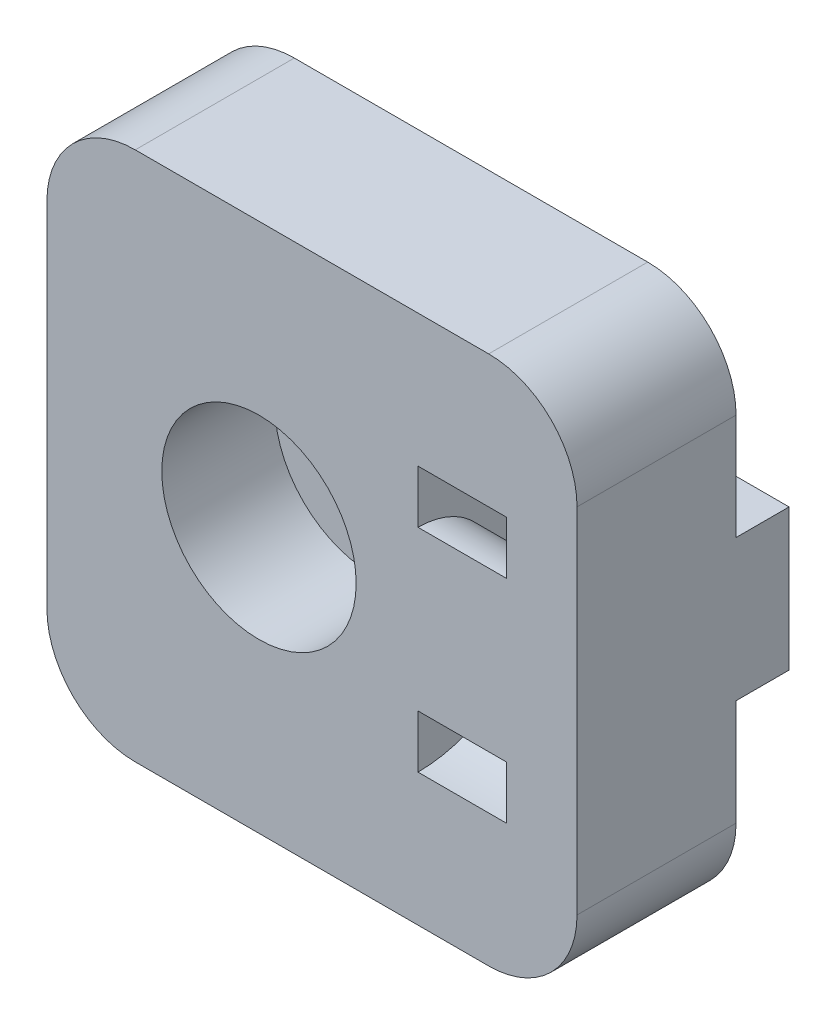
ISO-10303-21;
HEADER;
FILE_DESCRIPTION(('STEP AP214'),'2;1');
FILE_NAME('part.step','',(''),(''),'','','');
FILE_SCHEMA(('AUTOMOTIVE_DESIGN { 1 0 10303 214 1 1 1 1 }'));
ENDSEC;
DATA;
#1=APPLICATION_CONTEXT('core data for automotive mechanical design processes');
#2=APPLICATION_PROTOCOL_DEFINITION('international standard','automotive_design',2000,#1);
#3=PRODUCT_CONTEXT('',#1,'mechanical');
#4=PRODUCT('Part','Part','',(#3));
#5=PRODUCT_RELATED_PRODUCT_CATEGORY('part','',(#4));
#6=PRODUCT_DEFINITION_FORMATION('','',#4);
#7=PRODUCT_DEFINITION_CONTEXT('part definition',#1,'design');
#8=PRODUCT_DEFINITION('design','',#6,#7);
#9=PRODUCT_DEFINITION_SHAPE('','',#8);
#10=(LENGTH_UNIT() NAMED_UNIT(*) SI_UNIT(.MILLI.,.METRE.));
#11=(NAMED_UNIT(*) PLANE_ANGLE_UNIT() SI_UNIT($,.RADIAN.));
#12=(NAMED_UNIT(*) SI_UNIT($,.STERADIAN.) SOLID_ANGLE_UNIT());
#13=UNCERTAINTY_MEASURE_WITH_UNIT(LENGTH_MEASURE(1.E-05),#10,'distance_accuracy_value','');
#14=(GEOMETRIC_REPRESENTATION_CONTEXT(3) GLOBAL_UNCERTAINTY_ASSIGNED_CONTEXT((#13)) GLOBAL_UNIT_ASSIGNED_CONTEXT((#10,
#11,#12)) REPRESENTATION_CONTEXT('',''));
#15=CARTESIAN_POINT('',(0.,0.,0.));
#16=DIRECTION('',(0.,0.,1.));
#17=DIRECTION('',(1.,0.,0.));
#18=AXIS2_PLACEMENT_3D('',#15,#16,#17);
#19=CARTESIAN_POINT('',(0.,0.,0.));
#20=DIRECTION('',(0.,0.,1.));
#21=DIRECTION('',(1.,0.,0.));
#22=AXIS2_PLACEMENT_3D('',#19,#20,#21);
#23=PLANE('',#22);
#24=CARTESIAN_POINT('',(-3.,0.,0.));
#25=DIRECTION('',(0.,0.,1.));
#26=DIRECTION('',(1.,0.,0.));
#27=AXIS2_PLACEMENT_3D('',#24,#25,#26);
#28=CIRCLE('',#27,3.3);
#29=CARTESIAN_POINT('',(0.299999999999997,0.,0.));
#30=VERTEX_POINT('',#29);
#31=EDGE_CURVE('E260',#30,#30,#28,.T.);
#32=ORIENTED_EDGE('',*,*,#31,.T.);
#33=EDGE_LOOP('',(#32));
#34=FACE_BOUND('',#33,.T.);
#35=DIRECTION('',(1.,0.,0.));
#36=VECTOR('',#35,1.);
#37=CARTESIAN_POINT('',(-15.,-15.,0.));
#38=LINE('',#37,#36);
#39=CARTESIAN_POINT('',(-9.99999999999999,-15.,0.));
#40=VERTEX_POINT('',#39);
#41=CARTESIAN_POINT('',(10.,-15.,0.));
#42=VERTEX_POINT('',#41);
#43=EDGE_CURVE('E267',#40,#42,#38,.T.);
#44=ORIENTED_EDGE('',*,*,#43,.F.);
#45=CARTESIAN_POINT('',(-9.99999999999999,-10.,0.));
#46=DIRECTION('',(0.,0.,1.));
#47=DIRECTION('',(1.,0.,0.));
#48=AXIS2_PLACEMENT_3D('',#45,#46,#47);
#49=CIRCLE('',#48,5.);
#50=CARTESIAN_POINT('',(-15.,-10.,0.));
#51=VERTEX_POINT('',#50);
#52=EDGE_CURVE('E348',#40,#51,#49,.F.);
#53=ORIENTED_EDGE('',*,*,#52,.T.);
#54=DIRECTION('',(0.,-1.,0.));
#55=VECTOR('',#54,1.);
#56=CARTESIAN_POINT('',(-15.,15.,0.));
#57=LINE('',#56,#55);
#58=CARTESIAN_POINT('',(-15.,-4.,0.));
#59=VERTEX_POINT('',#58);
#60=EDGE_CURVE('E280',#59,#51,#57,.T.);
#61=ORIENTED_EDGE('',*,*,#60,.F.);
#62=DIRECTION('',(-1.,0.,0.));
#63=VECTOR('',#62,1.);
#64=CARTESIAN_POINT('',(0.,-4.,0.));
#65=LINE('',#64,#63);
#66=CARTESIAN_POINT('',(-11.616843969807,-4.,0.));
#67=VERTEX_POINT('',#66);
#68=EDGE_CURVE('E206',#67,#59,#65,.T.);
#69=ORIENTED_EDGE('',*,*,#68,.F.);
#70=CARTESIAN_POINT('',(-3.,0.,0.));
#71=DIRECTION('',(0.,0.,-1.));
#72=DIRECTION('',(-1.,0.,0.));
#73=AXIS2_PLACEMENT_3D('',#70,#71,#72);
#74=CIRCLE('',#73,9.5);
#75=CARTESIAN_POINT('',(-11.616843969807,4.,0.));
#76=VERTEX_POINT('',#75);
#77=EDGE_CURVE('E186',#67,#76,#74,.T.);
#78=ORIENTED_EDGE('',*,*,#77,.T.);
#79=DIRECTION('',(-1.,0.,0.));
#80=VECTOR('',#79,1.);
#81=CARTESIAN_POINT('',(0.,4.,0.));
#82=LINE('',#81,#80);
#83=CARTESIAN_POINT('',(-15.,4.,0.));
#84=VERTEX_POINT('',#83);
#85=EDGE_CURVE('E203',#76,#84,#82,.T.);
#86=ORIENTED_EDGE('',*,*,#85,.T.);
#87=CARTESIAN_POINT('',(-15.,10.,0.));
#88=VERTEX_POINT('',#87);
#89=EDGE_CURVE('E281',#88,#84,#57,.T.);
#90=ORIENTED_EDGE('',*,*,#89,.F.);
#91=CARTESIAN_POINT('',(-10.,10.,0.));
#92=DIRECTION('',(0.,0.,1.));
#93=DIRECTION('',(1.,0.,0.));
#94=AXIS2_PLACEMENT_3D('',#91,#92,#93);
#95=CIRCLE('',#94,5.);
#96=CARTESIAN_POINT('',(-10.,15.,0.));
#97=VERTEX_POINT('',#96);
#98=EDGE_CURVE('E342',#88,#97,#95,.F.);
#99=ORIENTED_EDGE('',*,*,#98,.T.);
#100=DIRECTION('',(-1.,0.,0.));
#101=VECTOR('',#100,1.);
#102=CARTESIAN_POINT('',(-15.,15.,0.));
#103=LINE('',#102,#101);
#104=CARTESIAN_POINT('',(9.99999999999999,15.,0.));
#105=VERTEX_POINT('',#104);
#106=EDGE_CURVE('E278',#105,#97,#103,.T.);
#107=ORIENTED_EDGE('',*,*,#106,.F.);
#108=CARTESIAN_POINT('',(9.99999999999999,10.,0.));
#109=DIRECTION('',(0.,0.,1.));
#110=DIRECTION('',(1.,0.,0.));
#111=AXIS2_PLACEMENT_3D('',#108,#109,#110);
#112=CIRCLE('',#111,5.);
#113=CARTESIAN_POINT('',(15.,10.,0.));
#114=VERTEX_POINT('',#113);
#115=EDGE_CURVE('E344',#105,#114,#112,.F.);
#116=ORIENTED_EDGE('',*,*,#115,.T.);
#117=DIRECTION('',(0.,1.,0.));
#118=VECTOR('',#117,1.);
#119=CARTESIAN_POINT('',(15.,15.,0.));
#120=LINE('',#119,#118);
#121=CARTESIAN_POINT('',(15.,4.,0.));
#122=VERTEX_POINT('',#121);
#123=EDGE_CURVE('E263',#122,#114,#120,.T.);
#124=ORIENTED_EDGE('',*,*,#123,.F.);
#125=DIRECTION('',(-1.,0.,0.));
#126=VECTOR('',#125,1.);
#127=CARTESIAN_POINT('',(0.,4.,0.));
#128=LINE('',#127,#126);
#129=CARTESIAN_POINT('',(5.61684396980704,4.,0.));
#130=VERTEX_POINT('',#129);
#131=EDGE_CURVE('E231',#122,#130,#128,.T.);
#132=ORIENTED_EDGE('',*,*,#131,.T.);
#133=CARTESIAN_POINT('',(-3.,0.,0.));
#134=DIRECTION('',(0.,0.,-1.));
#135=DIRECTION('',(-1.,0.,0.));
#136=AXIS2_PLACEMENT_3D('',#133,#134,#135);
#137=CIRCLE('',#136,9.5);
#138=CARTESIAN_POINT('',(5.61684396980704,-4.,0.));
#139=VERTEX_POINT('',#138);
#140=EDGE_CURVE('E190',#130,#139,#137,.T.);
#141=ORIENTED_EDGE('',*,*,#140,.T.);
#142=DIRECTION('',(-1.,0.,0.));
#143=VECTOR('',#142,1.);
#144=CARTESIAN_POINT('',(0.,-4.,0.));
#145=LINE('',#144,#143);
#146=CARTESIAN_POINT('',(15.,-4.,0.));
#147=VERTEX_POINT('',#146);
#148=EDGE_CURVE('E223',#147,#139,#145,.T.);
#149=ORIENTED_EDGE('',*,*,#148,.F.);
#150=CARTESIAN_POINT('',(15.,-9.99999999999999,0.));
#151=VERTEX_POINT('',#150);
#152=EDGE_CURVE('E276',#151,#147,#120,.T.);
#153=ORIENTED_EDGE('',*,*,#152,.F.);
#154=CARTESIAN_POINT('',(10.,-10.,0.));
#155=DIRECTION('',(0.,0.,1.));
#156=DIRECTION('',(1.,0.,0.));
#157=AXIS2_PLACEMENT_3D('',#154,#155,#156);
#158=CIRCLE('',#157,5.);
#159=EDGE_CURVE('E346',#151,#42,#158,.F.);
#160=ORIENTED_EDGE('',*,*,#159,.T.);
#161=EDGE_LOOP('',(#44,#53,#61,#69,#78,#86,#90,#99,#107,#116,#124,#132,#141,#149,#153,#160));
#162=FACE_BOUND('',#161,.T.);
#163=ADVANCED_FACE('F41',(#34,#162),#23,.F.);
#164=CARTESIAN_POINT('',(15.,15.,9.));
#165=DIRECTION('',(-1.,0.,0.));
#166=DIRECTION('',(0.,-1.,0.));
#167=AXIS2_PLACEMENT_3D('',#164,#165,#166);
#168=PLANE('',#167);
#169=DIRECTION('',(0.,1.,0.));
#170=VECTOR('',#169,1.);
#171=CARTESIAN_POINT('',(15.,15.,9.));
#172=LINE('',#171,#170);
#173=CARTESIAN_POINT('',(15.,-9.99999999999999,9.));
#174=VERTEX_POINT('',#173);
#175=CARTESIAN_POINT('',(15.,10.,9.));
#176=VERTEX_POINT('',#175);
#177=EDGE_CURVE('E264',#174,#176,#172,.T.);
#178=ORIENTED_EDGE('',*,*,#177,.F.);
#179=DIRECTION('',(0.,0.,-1.));
#180=VECTOR('',#179,1.);
#181=CARTESIAN_POINT('',(15.,-9.99999999999999,9.));
#182=LINE('',#181,#180);
#183=EDGE_CURVE('E364',#174,#151,#182,.T.);
#184=ORIENTED_EDGE('',*,*,#183,.T.);
#185=ORIENTED_EDGE('',*,*,#152,.T.);
#186=DIRECTION('',(0.,0.,1.));
#187=VECTOR('',#186,1.);
#188=CARTESIAN_POINT('',(15.,-4.,-3.));
#189=LINE('',#188,#187);
#190=CARTESIAN_POINT('',(15.,-4.,-3.));
#191=VERTEX_POINT('',#190);
#192=EDGE_CURVE('E228',#191,#147,#189,.T.);
#193=ORIENTED_EDGE('',*,*,#192,.F.);
#194=DIRECTION('',(0.,-1.,0.));
#195=VECTOR('',#194,1.);
#196=CARTESIAN_POINT('',(15.,0.,-3.));
#197=LINE('',#196,#195);
#198=CARTESIAN_POINT('',(15.,4.,-3.));
#199=VERTEX_POINT('',#198);
#200=EDGE_CURVE('E222',#199,#191,#197,.T.);
#201=ORIENTED_EDGE('',*,*,#200,.F.);
#202=DIRECTION('',(0.,0.,1.));
#203=VECTOR('',#202,1.);
#204=CARTESIAN_POINT('',(15.,4.,-3.));
#205=LINE('',#204,#203);
#206=EDGE_CURVE('E238',#199,#122,#205,.T.);
#207=ORIENTED_EDGE('',*,*,#206,.T.);
#208=ORIENTED_EDGE('',*,*,#123,.T.);
#209=DIRECTION('',(0.,0.,-1.));
#210=VECTOR('',#209,1.);
#211=CARTESIAN_POINT('',(15.,10.,9.));
#212=LINE('',#211,#210);
#213=EDGE_CURVE('E362',#114,#176,#212,.F.);
#214=ORIENTED_EDGE('',*,*,#213,.T.);
#215=EDGE_LOOP('',(#178,#184,#185,#193,#201,#207,#208,#214));
#216=FACE_BOUND('',#215,.T.);
#217=ADVANCED_FACE('F370',(#216),#168,.F.);
#218=CARTESIAN_POINT('',(-15.,15.,9.));
#219=DIRECTION('',(0.,-1.,0.));
#220=DIRECTION('',(0.,0.,-1.));
#221=AXIS2_PLACEMENT_3D('',#218,#219,#220);
#222=PLANE('',#221);
#223=DIRECTION('',(-1.,0.,0.));
#224=VECTOR('',#223,1.);
#225=CARTESIAN_POINT('',(-15.,15.,9.));
#226=LINE('',#225,#224);
#227=CARTESIAN_POINT('',(9.99999999999999,15.,9.));
#228=VERTEX_POINT('',#227);
#229=CARTESIAN_POINT('',(-10.,15.,9.));
#230=VERTEX_POINT('',#229);
#231=EDGE_CURVE('E266',#228,#230,#226,.T.);
#232=ORIENTED_EDGE('',*,*,#231,.F.);
#233=DIRECTION('',(0.,0.,-1.));
#234=VECTOR('',#233,1.);
#235=CARTESIAN_POINT('',(9.99999999999999,15.,9.));
#236=LINE('',#235,#234);
#237=EDGE_CURVE('E11',#228,#105,#236,.T.);
#238=ORIENTED_EDGE('',*,*,#237,.T.);
#239=ORIENTED_EDGE('',*,*,#106,.T.);
#240=DIRECTION('',(0.,0.,-1.));
#241=VECTOR('',#240,1.);
#242=CARTESIAN_POINT('',(-10.,15.,9.));
#243=LINE('',#242,#241);
#244=EDGE_CURVE('E49',#97,#230,#243,.F.);
#245=ORIENTED_EDGE('',*,*,#244,.T.);
#246=EDGE_LOOP('',(#232,#238,#239,#245));
#247=FACE_BOUND('',#246,.T.);
#248=ADVANCED_FACE('F403',(#247),#222,.F.);
#249=CARTESIAN_POINT('',(-15.,15.,9.));
#250=DIRECTION('',(1.,0.,0.));
#251=DIRECTION('',(0.,1.,0.));
#252=AXIS2_PLACEMENT_3D('',#249,#250,#251);
#253=PLANE('',#252);
#254=ORIENTED_EDGE('',*,*,#60,.T.);
#255=DIRECTION('',(0.,0.,-1.));
#256=VECTOR('',#255,1.);
#257=CARTESIAN_POINT('',(-15.,-10.,9.));
#258=LINE('',#257,#256);
#259=CARTESIAN_POINT('',(-15.,-10.,9.));
#260=VERTEX_POINT('',#259);
#261=EDGE_CURVE('E353',#51,#260,#258,.F.);
#262=ORIENTED_EDGE('',*,*,#261,.T.);
#263=DIRECTION('',(0.,-1.,0.));
#264=VECTOR('',#263,1.);
#265=CARTESIAN_POINT('',(-15.,15.,9.));
#266=LINE('',#265,#264);
#267=CARTESIAN_POINT('',(-15.,10.,9.));
#268=VERTEX_POINT('',#267);
#269=EDGE_CURVE('E269',#268,#260,#266,.T.);
#270=ORIENTED_EDGE('',*,*,#269,.F.);
#271=DIRECTION('',(0.,0.,-1.));
#272=VECTOR('',#271,1.);
#273=CARTESIAN_POINT('',(-15.,10.,9.));
#274=LINE('',#273,#272);
#275=EDGE_CURVE('E350',#268,#88,#274,.T.);
#276=ORIENTED_EDGE('',*,*,#275,.T.);
#277=ORIENTED_EDGE('',*,*,#89,.T.);
#278=DIRECTION('',(0.,0.,1.));
#279=VECTOR('',#278,1.);
#280=CARTESIAN_POINT('',(-15.,4.,-3.));
#281=LINE('',#280,#279);
#282=CARTESIAN_POINT('',(-15.,4.,-3.));
#283=VERTEX_POINT('',#282);
#284=EDGE_CURVE('E215',#283,#84,#281,.T.);
#285=ORIENTED_EDGE('',*,*,#284,.F.);
#286=DIRECTION('',(0.,1.,0.));
#287=VECTOR('',#286,1.);
#288=CARTESIAN_POINT('',(-15.,0.,-3.));
#289=LINE('',#288,#287);
#290=CARTESIAN_POINT('',(-15.,-4.,-3.));
#291=VERTEX_POINT('',#290);
#292=EDGE_CURVE('E198',#291,#283,#289,.T.);
#293=ORIENTED_EDGE('',*,*,#292,.F.);
#294=DIRECTION('',(0.,0.,1.));
#295=VECTOR('',#294,1.);
#296=CARTESIAN_POINT('',(-15.,-4.,-3.));
#297=LINE('',#296,#295);
#298=EDGE_CURVE('E191',#291,#59,#297,.T.);
#299=ORIENTED_EDGE('',*,*,#298,.T.);
#300=EDGE_LOOP('',(#254,#262,#270,#276,#277,#285,#293,#299));
#301=FACE_BOUND('',#300,.T.);
#302=ADVANCED_FACE('F411',(#301),#253,.F.);
#303=CARTESIAN_POINT('',(-15.,-15.,9.));
#304=DIRECTION('',(0.,1.,0.));
#305=DIRECTION('',(0.,0.,1.));
#306=AXIS2_PLACEMENT_3D('',#303,#304,#305);
#307=PLANE('',#306);
#308=DIRECTION('',(1.,0.,0.));
#309=VECTOR('',#308,1.);
#310=CARTESIAN_POINT('',(-15.,-15.,9.));
#311=LINE('',#310,#309);
#312=CARTESIAN_POINT('',(-9.99999999999999,-15.,9.));
#313=VERTEX_POINT('',#312);
#314=CARTESIAN_POINT('',(10.,-15.,9.));
#315=VERTEX_POINT('',#314);
#316=EDGE_CURVE('E272',#313,#315,#311,.T.);
#317=ORIENTED_EDGE('',*,*,#316,.F.);
#318=DIRECTION('',(0.,0.,-1.));
#319=VECTOR('',#318,1.);
#320=CARTESIAN_POINT('',(-9.99999999999999,-15.,9.));
#321=LINE('',#320,#319);
#322=EDGE_CURVE('E339',#313,#40,#321,.T.);
#323=ORIENTED_EDGE('',*,*,#322,.T.);
#324=ORIENTED_EDGE('',*,*,#43,.T.);
#325=DIRECTION('',(0.,0.,-1.));
#326=VECTOR('',#325,1.);
#327=CARTESIAN_POINT('',(10.,-15.,9.));
#328=LINE('',#327,#326);
#329=EDGE_CURVE('E337',#42,#315,#328,.F.);
#330=ORIENTED_EDGE('',*,*,#329,.T.);
#331=EDGE_LOOP('',(#317,#323,#324,#330));
#332=FACE_BOUND('',#331,.T.);
#333=ADVANCED_FACE('F408',(#332),#307,.F.);
#334=CARTESIAN_POINT('',(0.,0.,9.));
#335=DIRECTION('',(0.,0.,1.));
#336=DIRECTION('',(1.,0.,0.));
#337=AXIS2_PLACEMENT_3D('',#334,#335,#336);
#338=PLANE('',#337);
#339=DIRECTION('',(1.,0.,0.));
#340=VECTOR('',#339,1.);
#341=CARTESIAN_POINT('',(6.,-7.5,9.));
#342=LINE('',#341,#340);
#343=CARTESIAN_POINT('',(6.,-7.5,9.));
#344=VERTEX_POINT('',#343);
#345=CARTESIAN_POINT('',(11.,-7.5,9.));
#346=VERTEX_POINT('',#345);
#347=EDGE_CURVE('E299',#344,#346,#342,.T.);
#348=ORIENTED_EDGE('',*,*,#347,.F.);
#349=DIRECTION('',(0.,1.,0.));
#350=VECTOR('',#349,1.);
#351=CARTESIAN_POINT('',(6.,0.,9.));
#352=LINE('',#351,#350);
#353=CARTESIAN_POINT('',(6.,-4.5,9.));
#354=VERTEX_POINT('',#353);
#355=EDGE_CURVE('E294',#344,#354,#352,.T.);
#356=ORIENTED_EDGE('',*,*,#355,.T.);
#357=DIRECTION('',(1.,0.,0.));
#358=VECTOR('',#357,1.);
#359=CARTESIAN_POINT('',(6.,-4.5,9.));
#360=LINE('',#359,#358);
#361=CARTESIAN_POINT('',(11.,-4.5,9.));
#362=VERTEX_POINT('',#361);
#363=EDGE_CURVE('E296',#354,#362,#360,.T.);
#364=ORIENTED_EDGE('',*,*,#363,.T.);
#365=DIRECTION('',(0.,1.,0.));
#366=VECTOR('',#365,1.);
#367=CARTESIAN_POINT('',(11.,0.,9.));
#368=LINE('',#367,#366);
#369=EDGE_CURVE('E290',#346,#362,#368,.T.);
#370=ORIENTED_EDGE('',*,*,#369,.F.);
#371=EDGE_LOOP('',(#348,#356,#364,#370));
#372=FACE_BOUND('',#371,.T.);
#373=DIRECTION('',(1.,0.,0.));
#374=VECTOR('',#373,1.);
#375=CARTESIAN_POINT('',(6.,7.5,9.));
#376=LINE('',#375,#374);
#377=CARTESIAN_POINT('',(11.,7.5,9.));
#378=VERTEX_POINT('',#377);
#379=CARTESIAN_POINT('',(6.,7.5,9.));
#380=VERTEX_POINT('',#379);
#381=EDGE_CURVE('E293',#378,#380,#376,.F.);
#382=ORIENTED_EDGE('',*,*,#381,.F.);
#383=CARTESIAN_POINT('',(11.,4.5,9.));
#384=VERTEX_POINT('',#383);
#385=EDGE_CURVE('E287',#384,#378,#368,.T.);
#386=ORIENTED_EDGE('',*,*,#385,.F.);
#387=DIRECTION('',(1.,0.,0.));
#388=VECTOR('',#387,1.);
#389=CARTESIAN_POINT('',(6.,4.5,9.));
#390=LINE('',#389,#388);
#391=CARTESIAN_POINT('',(6.,4.5,9.));
#392=VERTEX_POINT('',#391);
#393=EDGE_CURVE('E275',#384,#392,#390,.F.);
#394=ORIENTED_EDGE('',*,*,#393,.T.);
#395=EDGE_CURVE('E289',#392,#380,#352,.T.);
#396=ORIENTED_EDGE('',*,*,#395,.T.);
#397=EDGE_LOOP('',(#382,#386,#394,#396));
#398=FACE_BOUND('',#397,.T.);
#399=CARTESIAN_POINT('',(-3.,0.,9.));
#400=DIRECTION('',(0.,0.,1.));
#401=DIRECTION('',(1.,0.,0.));
#402=AXIS2_PLACEMENT_3D('',#399,#400,#401);
#403=CIRCLE('',#402,5.49999999999999);
#404=CARTESIAN_POINT('',(2.49999999999999,0.,9.));
#405=VERTEX_POINT('',#404);
#406=EDGE_CURVE('E249',#405,#405,#403,.T.);
#407=ORIENTED_EDGE('',*,*,#406,.F.);
#408=EDGE_LOOP('',(#407));
#409=FACE_BOUND('',#408,.T.);
#410=ORIENTED_EDGE('',*,*,#269,.T.);
#411=CARTESIAN_POINT('',(-9.99999999999999,-10.,9.));
#412=DIRECTION('',(0.,0.,1.));
#413=DIRECTION('',(1.,0.,0.));
#414=AXIS2_PLACEMENT_3D('',#411,#412,#413);
#415=CIRCLE('',#414,5.);
#416=EDGE_CURVE('E360',#260,#313,#415,.T.);
#417=ORIENTED_EDGE('',*,*,#416,.T.);
#418=ORIENTED_EDGE('',*,*,#316,.T.);
#419=CARTESIAN_POINT('',(10.,-10.,9.));
#420=DIRECTION('',(0.,0.,1.));
#421=DIRECTION('',(1.,0.,0.));
#422=AXIS2_PLACEMENT_3D('',#419,#420,#421);
#423=CIRCLE('',#422,5.);
#424=EDGE_CURVE('E358',#315,#174,#423,.T.);
#425=ORIENTED_EDGE('',*,*,#424,.T.);
#426=ORIENTED_EDGE('',*,*,#177,.T.);
#427=CARTESIAN_POINT('',(9.99999999999999,10.,9.));
#428=DIRECTION('',(0.,0.,1.));
#429=DIRECTION('',(1.,0.,0.));
#430=AXIS2_PLACEMENT_3D('',#427,#428,#429);
#431=CIRCLE('',#430,5.);
#432=EDGE_CURVE('E62',#176,#228,#431,.T.);
#433=ORIENTED_EDGE('',*,*,#432,.T.);
#434=ORIENTED_EDGE('',*,*,#231,.T.);
#435=CARTESIAN_POINT('',(-10.,10.,9.));
#436=DIRECTION('',(0.,0.,1.));
#437=DIRECTION('',(1.,0.,0.));
#438=AXIS2_PLACEMENT_3D('',#435,#436,#437);
#439=CIRCLE('',#438,5.);
#440=EDGE_CURVE('E355',#230,#268,#439,.T.);
#441=ORIENTED_EDGE('',*,*,#440,.T.);
#442=EDGE_LOOP('',(#410,#417,#418,#425,#426,#433,#434,#441));
#443=FACE_BOUND('',#442,.T.);
#444=ADVANCED_FACE('F406',(#372,#398,#409,#443),#338,.T.);
#445=CARTESIAN_POINT('',(-3.,0.,9.));
#446=DIRECTION('',(0.,0.,1.));
#447=DIRECTION('',(1.,0.,0.));
#448=AXIS2_PLACEMENT_3D('',#445,#446,#447);
#449=CYLINDRICAL_SURFACE('',#448,3.3);
#450=ORIENTED_EDGE('',*,*,#31,.F.);
#451=EDGE_LOOP('',(#450));
#452=FACE_BOUND('',#451,.T.);
#453=CARTESIAN_POINT('',(-3.,0.,2.6));
#454=DIRECTION('',(0.,0.,1.));
#455=DIRECTION('',(1.,0.,0.));
#456=AXIS2_PLACEMENT_3D('',#453,#454,#455);
#457=CIRCLE('',#456,3.3);
#458=CARTESIAN_POINT('',(0.299999999999998,0.,2.6));
#459=VERTEX_POINT('',#458);
#460=EDGE_CURVE('E257',#459,#459,#457,.T.);
#461=ORIENTED_EDGE('',*,*,#460,.T.);
#462=EDGE_LOOP('',(#461));
#463=FACE_BOUND('',#462,.T.);
#464=ADVANCED_FACE('F505',(#452,#463),#449,.F.);
#465=CARTESIAN_POINT('',(0.299999999999998,0.,2.6));
#466=DIRECTION('',(0.,0.,-1.));
#467=DIRECTION('',(-1.,0.,0.));
#468=AXIS2_PLACEMENT_3D('',#465,#466,#467);
#469=PLANE('',#468);
#470=ORIENTED_EDGE('',*,*,#460,.F.);
#471=EDGE_LOOP('',(#470));
#472=FACE_BOUND('',#471,.T.);
#473=CARTESIAN_POINT('',(-3.,0.,2.6));
#474=DIRECTION('',(0.,0.,1.));
#475=DIRECTION('',(1.,0.,0.));
#476=AXIS2_PLACEMENT_3D('',#473,#474,#475);
#477=CIRCLE('',#476,5.5);
#478=CARTESIAN_POINT('',(2.5,0.,2.6));
#479=VERTEX_POINT('',#478);
#480=EDGE_CURVE('E254',#479,#479,#477,.T.);
#481=ORIENTED_EDGE('',*,*,#480,.T.);
#482=EDGE_LOOP('',(#481));
#483=FACE_BOUND('',#482,.T.);
#484=ADVANCED_FACE('F497',(#472,#483),#469,.F.);
#485=CARTESIAN_POINT('',(-3.,0.,9.));
#486=DIRECTION('',(0.,0.,1.));
#487=DIRECTION('',(1.,0.,0.));
#488=AXIS2_PLACEMENT_3D('',#485,#486,#487);
#489=CYLINDRICAL_SURFACE('',#488,5.5);
#490=ORIENTED_EDGE('',*,*,#480,.F.);
#491=EDGE_LOOP('',(#490));
#492=FACE_BOUND('',#491,.T.);
#493=ORIENTED_EDGE('',*,*,#406,.T.);
#494=EDGE_LOOP('',(#493));
#495=FACE_BOUND('',#494,.T.);
#496=ADVANCED_FACE('F489',(#492,#495),#489,.F.);
#497=CARTESIAN_POINT('',(6.,0.,9.));
#498=DIRECTION('',(1.,0.,0.));
#499=DIRECTION('',(0.,1.,0.));
#500=AXIS2_PLACEMENT_3D('',#497,#498,#499);
#501=CYLINDRICAL_SURFACE('',#500,7.5);
#502=ORIENTED_EDGE('',*,*,#347,.T.);
#503=CARTESIAN_POINT('',(11.,0.,9.));
#504=DIRECTION('',(1.,0.,0.));
#505=DIRECTION('',(0.,1.,0.));
#506=AXIS2_PLACEMENT_3D('',#503,#504,#505);
#507=CIRCLE('',#506,7.5);
#508=EDGE_CURVE('E243',#346,#378,#507,.T.);
#509=ORIENTED_EDGE('',*,*,#508,.T.);
#510=ORIENTED_EDGE('',*,*,#381,.T.);
#511=CARTESIAN_POINT('',(6.,0.,9.));
#512=DIRECTION('',(1.,0.,0.));
#513=DIRECTION('',(0.,1.,0.));
#514=AXIS2_PLACEMENT_3D('',#511,#512,#513);
#515=CIRCLE('',#514,7.5);
#516=EDGE_CURVE('E246',#344,#380,#515,.T.);
#517=ORIENTED_EDGE('',*,*,#516,.F.);
#518=EDGE_LOOP('',(#502,#509,#510,#517));
#519=FACE_BOUND('',#518,.T.);
#520=ADVANCED_FACE('F482',(#519),#501,.F.);
#521=CARTESIAN_POINT('',(6.,0.,9.));
#522=DIRECTION('',(1.,0.,0.));
#523=DIRECTION('',(0.,1.,0.));
#524=AXIS2_PLACEMENT_3D('',#521,#522,#523);
#525=PLANE('',#524);
#526=ORIENTED_EDGE('',*,*,#516,.T.);
#527=ORIENTED_EDGE('',*,*,#395,.F.);
#528=CARTESIAN_POINT('',(6.,0.,9.));
#529=DIRECTION('',(1.,0.,0.));
#530=DIRECTION('',(0.,1.,0.));
#531=AXIS2_PLACEMENT_3D('',#528,#529,#530);
#532=CIRCLE('',#531,4.5);
#533=EDGE_CURVE('E241',#354,#392,#532,.T.);
#534=ORIENTED_EDGE('',*,*,#533,.F.);
#535=ORIENTED_EDGE('',*,*,#355,.F.);
#536=EDGE_LOOP('',(#526,#527,#534,#535));
#537=FACE_BOUND('',#536,.T.);
#538=ADVANCED_FACE('F474',(#537),#525,.T.);
#539=CARTESIAN_POINT('',(11.,0.,9.));
#540=DIRECTION('',(1.,0.,0.));
#541=DIRECTION('',(0.,1.,0.));
#542=AXIS2_PLACEMENT_3D('',#539,#540,#541);
#543=PLANE('',#542);
#544=ORIENTED_EDGE('',*,*,#369,.T.);
#545=CARTESIAN_POINT('',(11.,0.,9.));
#546=DIRECTION('',(1.,0.,0.));
#547=DIRECTION('',(0.,1.,0.));
#548=AXIS2_PLACEMENT_3D('',#545,#546,#547);
#549=CIRCLE('',#548,4.5);
#550=EDGE_CURVE('E240',#362,#384,#549,.T.);
#551=ORIENTED_EDGE('',*,*,#550,.T.);
#552=ORIENTED_EDGE('',*,*,#385,.T.);
#553=ORIENTED_EDGE('',*,*,#508,.F.);
#554=EDGE_LOOP('',(#544,#551,#552,#553));
#555=FACE_BOUND('',#554,.T.);
#556=ADVANCED_FACE('F467',(#555),#543,.F.);
#557=CARTESIAN_POINT('',(6.,0.,9.));
#558=DIRECTION('',(1.,0.,0.));
#559=DIRECTION('',(0.,1.,0.));
#560=AXIS2_PLACEMENT_3D('',#557,#558,#559);
#561=CYLINDRICAL_SURFACE('',#560,4.5);
#562=ORIENTED_EDGE('',*,*,#533,.T.);
#563=ORIENTED_EDGE('',*,*,#393,.F.);
#564=ORIENTED_EDGE('',*,*,#550,.F.);
#565=ORIENTED_EDGE('',*,*,#363,.F.);
#566=EDGE_LOOP('',(#562,#563,#564,#565));
#567=FACE_BOUND('',#566,.T.);
#568=ADVANCED_FACE('F328',(#567),#561,.T.);
#569=CARTESIAN_POINT('',(0.,4.,-3.));
#570=DIRECTION('',(0.,1.,0.));
#571=DIRECTION('',(0.,0.,1.));
#572=AXIS2_PLACEMENT_3D('',#569,#570,#571);
#573=PLANE('',#572);
#574=DIRECTION('',(-1.,0.,0.));
#575=VECTOR('',#574,1.);
#576=CARTESIAN_POINT('',(0.,4.,-3.));
#577=LINE('',#576,#575);
#578=CARTESIAN_POINT('',(8.84271928232701,4.,-3.));
#579=VERTEX_POINT('',#578);
#580=EDGE_CURVE('E219',#199,#579,#577,.T.);
#581=ORIENTED_EDGE('',*,*,#580,.T.);
#582=CARTESIAN_POINT('',(8.84271928232701,4.,-3.));
#583=CARTESIAN_POINT('',(8.57620953528937,4.,-2.74752182238784));
#584=CARTESIAN_POINT('',(8.30928088801171,4.,-2.49548405679672));
#585=CARTESIAN_POINT('',(7.77436847581593,4.,-1.9925462810641));
#586=CARTESIAN_POINT('',(7.50638474106195,4.,-1.74164623883096));
#587=CARTESIAN_POINT('',(6.96912683392598,4.,-1.24122377981038));
#588=CARTESIAN_POINT('',(6.69985264764974,4.,-0.99170137791848));
#589=CARTESIAN_POINT('',(6.15966345714519,4.,-0.494424359253609));
#590=CARTESIAN_POINT('',(5.88874840629492,4.,-0.246669793150004));
#591=CARTESIAN_POINT('',(5.61684396980704,4.,0.));
#592=B_SPLINE_CURVE_WITH_KNOTS('',3,(#582,#583,#584,#585,#586,#587,#588,#589,#590,#591),
.UNSPECIFIED.,.F.,.F.,(4,2,2,2,4),(0.,1.10134313552131,2.20265500988955,3.30397876881019,
4.40533396787489),.UNSPECIFIED.);
#593=EDGE_CURVE('E331',#579,#130,#592,.T.);
#594=ORIENTED_EDGE('',*,*,#593,.T.);
#595=ORIENTED_EDGE('',*,*,#131,.F.);
#596=ORIENTED_EDGE('',*,*,#206,.F.);
#597=EDGE_LOOP('',(#581,#594,#595,#596));
#598=FACE_BOUND('',#597,.T.);
#599=ADVANCED_FACE('F322',(#598),#573,.T.);
#600=CARTESIAN_POINT('',(0.,-4.,-3.));
#601=DIRECTION('',(0.,1.,0.));
#602=DIRECTION('',(0.,0.,1.));
#603=AXIS2_PLACEMENT_3D('',#600,#601,#602);
#604=PLANE('',#603);
#605=ORIENTED_EDGE('',*,*,#148,.T.);
#606=CARTESIAN_POINT('',(5.61684396980704,-4.,0.));
#607=CARTESIAN_POINT('',(5.88874840629492,-4.,-0.246669793150005));
#608=CARTESIAN_POINT('',(6.15966345714519,-4.,-0.494424359253609));
#609=CARTESIAN_POINT('',(6.69985264764974,-4.,-0.991701377918479));
#610=CARTESIAN_POINT('',(6.96912683392598,-4.,-1.24122377981038));
#611=CARTESIAN_POINT('',(7.50638474106195,-4.,-1.74164623883096));
#612=CARTESIAN_POINT('',(7.77436847581593,-4.,-1.9925462810641));
#613=CARTESIAN_POINT('',(8.30928088801171,-4.,-2.49548405679672));
#614=CARTESIAN_POINT('',(8.57620953528938,-4.,-2.74752182238783));
#615=CARTESIAN_POINT('',(8.84271928232702,-4.,-2.99999999999998));
#616=B_SPLINE_CURVE_WITH_KNOTS('',3,(#606,#607,#608,#609,#610,#611,#612,#613,#614,#615),
.UNSPECIFIED.,.F.,.F.,(4,2,2,2,4),(0.,1.1013551990647,2.20267895798534,3.30399083235357,
4.40533396787489),.UNSPECIFIED.);
#617=CARTESIAN_POINT('',(8.84271928232701,-4.,-3.));
#618=VERTEX_POINT('',#617);
#619=EDGE_CURVE('E301',#139,#618,#616,.T.);
#620=ORIENTED_EDGE('',*,*,#619,.T.);
#621=DIRECTION('',(-1.,0.,0.));
#622=VECTOR('',#621,1.);
#623=CARTESIAN_POINT('',(0.,-4.,-3.));
#624=LINE('',#623,#622);
#625=EDGE_CURVE('E225',#191,#618,#624,.T.);
#626=ORIENTED_EDGE('',*,*,#625,.F.);
#627=ORIENTED_EDGE('',*,*,#192,.T.);
#628=EDGE_LOOP('',(#605,#620,#626,#627));
#629=FACE_BOUND('',#628,.T.);
#630=ADVANCED_FACE('F316',(#629),#604,.F.);
#631=CARTESIAN_POINT('',(0.,0.,-3.));
#632=DIRECTION('',(0.,0.,-1.));
#633=DIRECTION('',(-1.,0.,0.));
#634=AXIS2_PLACEMENT_3D('',#631,#632,#633);
#635=PLANE('',#634);
#636=ORIENTED_EDGE('',*,*,#625,.T.);
#637=CARTESIAN_POINT('',(-3.,0.,-3.));
#638=DIRECTION('',(0.,0.,-1.));
#639=DIRECTION('',(-1.,0.,0.));
#640=AXIS2_PLACEMENT_3D('',#637,#638,#639);
#641=CIRCLE('',#640,12.5);
#642=EDGE_CURVE('E309',#618,#579,#641,.F.);
#643=ORIENTED_EDGE('',*,*,#642,.T.);
#644=ORIENTED_EDGE('',*,*,#580,.F.);
#645=ORIENTED_EDGE('',*,*,#200,.T.);
#646=EDGE_LOOP('',(#636,#643,#644,#645));
#647=FACE_BOUND('',#646,.T.);
#648=ADVANCED_FACE('F321',(#647),#635,.T.);
#649=CARTESIAN_POINT('',(-3.,0.,-3.));
#650=DIRECTION('',(0.,0.,1.));
#651=DIRECTION('',(1.,0.,0.));
#652=AXIS2_PLACEMENT_3D('',#649,#650,#651);
#653=CYLINDRICAL_SURFACE('',#652,9.5);
#654=ORIENTED_EDGE('',*,*,#77,.F.);
#655=DIRECTION('',(0.,0.,1.));
#656=VECTOR('',#655,1.);
#657=CARTESIAN_POINT('',(-11.616843969807,-4.,-3.));
#658=LINE('',#657,#656);
#659=CARTESIAN_POINT('',(-11.616843969807,-4.,-3.));
#660=VERTEX_POINT('',#659);
#661=EDGE_CURVE('E179',#660,#67,#658,.T.);
#662=ORIENTED_EDGE('',*,*,#661,.F.);
#663=CARTESIAN_POINT('',(-3.,0.,-3.));
#664=DIRECTION('',(0.,0.,-1.));
#665=DIRECTION('',(-1.,0.,0.));
#666=AXIS2_PLACEMENT_3D('',#663,#664,#665);
#667=CIRCLE('',#666,9.5);
#668=CARTESIAN_POINT('',(-11.616843969807,4.,-3.));
#669=VERTEX_POINT('',#668);
#670=EDGE_CURVE('E183',#660,#669,#667,.T.);
#671=ORIENTED_EDGE('',*,*,#670,.T.);
#672=DIRECTION('',(0.,0.,1.));
#673=VECTOR('',#672,1.);
#674=CARTESIAN_POINT('',(-11.616843969807,4.,-3.));
#675=LINE('',#674,#673);
#676=EDGE_CURVE('E211',#669,#76,#675,.T.);
#677=ORIENTED_EDGE('',*,*,#676,.T.);
#678=EDGE_LOOP('',(#654,#662,#671,#677));
#679=FACE_BOUND('',#678,.T.);
#680=ADVANCED_FACE('F181',(#679),#653,.F.);
#681=CARTESIAN_POINT('',(0.,-4.,-3.));
#682=DIRECTION('',(0.,1.,0.));
#683=DIRECTION('',(0.,0.,1.));
#684=AXIS2_PLACEMENT_3D('',#681,#682,#683);
#685=PLANE('',#684);
#686=ORIENTED_EDGE('',*,*,#68,.T.);
#687=ORIENTED_EDGE('',*,*,#298,.F.);
#688=DIRECTION('',(-1.,0.,0.));
#689=VECTOR('',#688,1.);
#690=CARTESIAN_POINT('',(0.,-4.,-3.));
#691=LINE('',#690,#689);
#692=EDGE_CURVE('E194',#660,#291,#691,.T.);
#693=ORIENTED_EDGE('',*,*,#692,.F.);
#694=ORIENTED_EDGE('',*,*,#661,.T.);
#695=EDGE_LOOP('',(#686,#687,#693,#694));
#696=FACE_BOUND('',#695,.T.);
#697=ADVANCED_FACE('F195',(#696),#685,.F.);
#698=CARTESIAN_POINT('',(0.,4.,-3.));
#699=DIRECTION('',(0.,1.,0.));
#700=DIRECTION('',(0.,0.,1.));
#701=AXIS2_PLACEMENT_3D('',#698,#699,#700);
#702=PLANE('',#701);
#703=ORIENTED_EDGE('',*,*,#85,.F.);
#704=ORIENTED_EDGE('',*,*,#676,.F.);
#705=DIRECTION('',(-1.,0.,0.));
#706=VECTOR('',#705,1.);
#707=CARTESIAN_POINT('',(0.,4.,-3.));
#708=LINE('',#707,#706);
#709=EDGE_CURVE('E202',#669,#283,#708,.T.);
#710=ORIENTED_EDGE('',*,*,#709,.T.);
#711=ORIENTED_EDGE('',*,*,#284,.T.);
#712=EDGE_LOOP('',(#703,#704,#710,#711));
#713=FACE_BOUND('',#712,.T.);
#714=ADVANCED_FACE('F395',(#713),#702,.T.);
#715=CARTESIAN_POINT('',(0.,0.,-3.));
#716=DIRECTION('',(0.,0.,-1.));
#717=DIRECTION('',(-1.,0.,0.));
#718=AXIS2_PLACEMENT_3D('',#715,#716,#717);
#719=PLANE('',#718);
#720=ORIENTED_EDGE('',*,*,#670,.F.);
#721=ORIENTED_EDGE('',*,*,#692,.T.);
#722=ORIENTED_EDGE('',*,*,#292,.T.);
#723=ORIENTED_EDGE('',*,*,#709,.F.);
#724=EDGE_LOOP('',(#720,#721,#722,#723));
#725=FACE_BOUND('',#724,.T.);
#726=ADVANCED_FACE('F200',(#725),#719,.T.);
#727=CARTESIAN_POINT('',(-3.,0.,0.));
#728=DIRECTION('',(0.,0.,-1.));
#729=DIRECTION('',(-1.,0.,0.));
#730=AXIS2_PLACEMENT_3D('',#727,#728,#729);
#731=CONICAL_SURFACE('',#730,9.5,0.78539816339745);
#732=ORIENTED_EDGE('',*,*,#593,.F.);
#733=ORIENTED_EDGE('',*,*,#642,.F.);
#734=ORIENTED_EDGE('',*,*,#619,.F.);
#735=ORIENTED_EDGE('',*,*,#140,.F.);
#736=EDGE_LOOP('',(#732,#733,#734,#735));
#737=FACE_BOUND('',#736,.T.);
#738=ADVANCED_FACE('F312',(#737),#731,.F.);
#739=CARTESIAN_POINT('',(-9.99999999999999,-10.,9.));
#740=DIRECTION('',(0.,0.,-1.));
#741=DIRECTION('',(-1.,0.,0.));
#742=AXIS2_PLACEMENT_3D('',#739,#740,#741);
#743=CYLINDRICAL_SURFACE('',#742,5.);
#744=ORIENTED_EDGE('',*,*,#416,.F.);
#745=ORIENTED_EDGE('',*,*,#261,.F.);
#746=ORIENTED_EDGE('',*,*,#52,.F.);
#747=ORIENTED_EDGE('',*,*,#322,.F.);
#748=EDGE_LOOP('',(#744,#745,#746,#747));
#749=FACE_BOUND('',#748,.T.);
#750=ADVANCED_FACE('F388',(#749),#743,.T.);
#751=CARTESIAN_POINT('',(10.,-10.,9.));
#752=DIRECTION('',(0.,0.,-1.));
#753=DIRECTION('',(-1.,0.,0.));
#754=AXIS2_PLACEMENT_3D('',#751,#752,#753);
#755=CYLINDRICAL_SURFACE('',#754,5.);
#756=ORIENTED_EDGE('',*,*,#424,.F.);
#757=ORIENTED_EDGE('',*,*,#329,.F.);
#758=ORIENTED_EDGE('',*,*,#159,.F.);
#759=ORIENTED_EDGE('',*,*,#183,.F.);
#760=EDGE_LOOP('',(#756,#757,#758,#759));
#761=FACE_BOUND('',#760,.T.);
#762=ADVANCED_FACE('F393',(#761),#755,.T.);
#763=CARTESIAN_POINT('',(9.99999999999999,10.,9.));
#764=DIRECTION('',(0.,0.,-1.));
#765=DIRECTION('',(-1.,0.,0.));
#766=AXIS2_PLACEMENT_3D('',#763,#764,#765);
#767=CYLINDRICAL_SURFACE('',#766,5.);
#768=ORIENTED_EDGE('',*,*,#432,.F.);
#769=ORIENTED_EDGE('',*,*,#213,.F.);
#770=ORIENTED_EDGE('',*,*,#115,.F.);
#771=ORIENTED_EDGE('',*,*,#237,.F.);
#772=EDGE_LOOP('',(#768,#769,#770,#771));
#773=FACE_BOUND('',#772,.T.);
#774=ADVANCED_FACE('F423',(#773),#767,.T.);
#775=CARTESIAN_POINT('',(-10.,10.,9.));
#776=DIRECTION('',(0.,0.,-1.));
#777=DIRECTION('',(-1.,0.,0.));
#778=AXIS2_PLACEMENT_3D('',#775,#776,#777);
#779=CYLINDRICAL_SURFACE('',#778,5.);
#780=ORIENTED_EDGE('',*,*,#440,.F.);
#781=ORIENTED_EDGE('',*,*,#244,.F.);
#782=ORIENTED_EDGE('',*,*,#98,.F.);
#783=ORIENTED_EDGE('',*,*,#275,.F.);
#784=EDGE_LOOP('',(#780,#781,#782,#783));
#785=FACE_BOUND('',#784,.T.);
#786=ADVANCED_FACE('F43',(#785),#779,.T.);
#787=CLOSED_SHELL('',(#163,#217,#248,#302,#333,#444,#464,#484,#496,#520,#538,#556,#568,#599,
#630,#648,#680,#697,#714,#726,#738,#750,#762,#774,#786));
#788=MANIFOLD_SOLID_BREP('B2',#787);
#789=ADVANCED_BREP_SHAPE_REPRESENTATION('',(#18,#788),#14);
#790=SHAPE_DEFINITION_REPRESENTATION(#9,#789);
ENDSEC;
END-ISO-10303-21;
